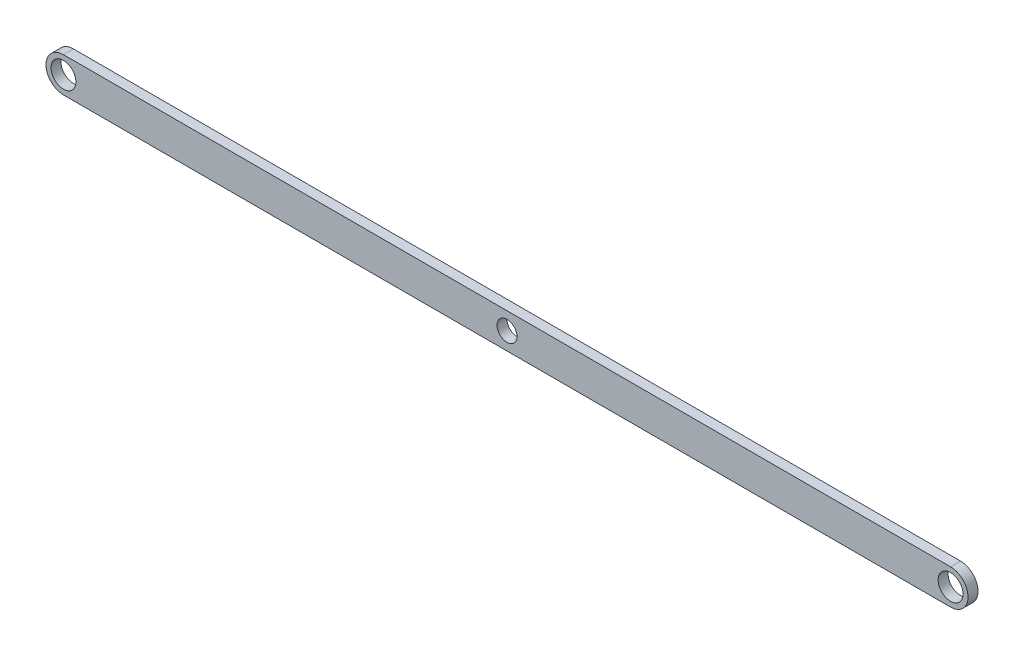
ISO-10303-21;
HEADER;
FILE_DESCRIPTION(('STEP AP214'),'2;1');
FILE_NAME('part.step','',(''),(''),'','','');
FILE_SCHEMA(('AUTOMOTIVE_DESIGN { 1 0 10303 214 1 1 1 1 }'));
ENDSEC;
DATA;
#1=APPLICATION_CONTEXT('core data for automotive mechanical design processes');
#2=APPLICATION_PROTOCOL_DEFINITION('international standard','automotive_design',2000,#1);
#3=PRODUCT_CONTEXT('',#1,'mechanical');
#4=PRODUCT('Part','Part','',(#3));
#5=PRODUCT_RELATED_PRODUCT_CATEGORY('part','',(#4));
#6=PRODUCT_DEFINITION_FORMATION('','',#4);
#7=PRODUCT_DEFINITION_CONTEXT('part definition',#1,'design');
#8=PRODUCT_DEFINITION('design','',#6,#7);
#9=PRODUCT_DEFINITION_SHAPE('','',#8);
#10=(LENGTH_UNIT() NAMED_UNIT(*) SI_UNIT(.MILLI.,.METRE.));
#11=(NAMED_UNIT(*) PLANE_ANGLE_UNIT() SI_UNIT($,.RADIAN.));
#12=(NAMED_UNIT(*) SI_UNIT($,.STERADIAN.) SOLID_ANGLE_UNIT());
#13=UNCERTAINTY_MEASURE_WITH_UNIT(LENGTH_MEASURE(1.E-05),#10,'distance_accuracy_value','');
#14=(GEOMETRIC_REPRESENTATION_CONTEXT(3) GLOBAL_UNCERTAINTY_ASSIGNED_CONTEXT((#13)) GLOBAL_UNIT_ASSIGNED_CONTEXT((#10,
#11,#12)) REPRESENTATION_CONTEXT('',''));
#15=CARTESIAN_POINT('',(0.,0.,0.));
#16=DIRECTION('',(0.,0.,1.));
#17=DIRECTION('',(1.,0.,0.));
#18=AXIS2_PLACEMENT_3D('',#15,#16,#17);
#19=CARTESIAN_POINT('',(-92.2615501062117,19.7290649407362,2.));
#20=DIRECTION('',(0.,0.,1.));
#21=DIRECTION('',(1.,0.,0.));
#22=AXIS2_PLACEMENT_3D('',#19,#20,#21);
#23=PLANE('',#22);
#24=CARTESIAN_POINT('',(-92.2615501062117,19.7290649407362,2.));
#25=DIRECTION('',(0.,0.,1.));
#26=DIRECTION('',(1.,0.,0.));
#27=AXIS2_PLACEMENT_3D('',#24,#25,#26);
#28=CIRCLE('',#27,2.49999999999999);
#29=CARTESIAN_POINT('',(-89.7615501062117,19.7290649407362,2.));
#30=VERTEX_POINT('',#29);
#31=EDGE_CURVE('E115',#30,#30,#28,.T.);
#32=ORIENTED_EDGE('',*,*,#31,.F.);
#33=EDGE_LOOP('',(#32));
#34=FACE_BOUND('',#33,.T.);
#35=CARTESIAN_POINT('',(-92.2615501062117,19.7290649407362,2.));
#36=DIRECTION('',(0.,0.,1.));
#37=DIRECTION('',(1.,0.,0.));
#38=AXIS2_PLACEMENT_3D('',#35,#36,#37);
#39=CIRCLE('',#38,3.5);
#40=CARTESIAN_POINT('',(-92.2615501062117,23.2290649407362,2.));
#41=VERTEX_POINT('',#40);
#42=CARTESIAN_POINT('',(-92.2615501062117,16.2290649407362,2.));
#43=VERTEX_POINT('',#42);
#44=EDGE_CURVE('E85',#41,#43,#39,.T.);
#45=ORIENTED_EDGE('',*,*,#44,.T.);
#46=DIRECTION('',(1.,0.,0.));
#47=VECTOR('',#46,1.);
#48=CARTESIAN_POINT('',(85.7384498937883,16.2290649407362,2.));
#49=LINE('',#48,#47);
#50=CARTESIAN_POINT('',(85.7384498937883,16.2290649407362,2.));
#51=VERTEX_POINT('',#50);
#52=EDGE_CURVE('E80',#43,#51,#49,.T.);
#53=ORIENTED_EDGE('',*,*,#52,.T.);
#54=CARTESIAN_POINT('',(85.7384498937883,19.7290649407362,2.));
#55=DIRECTION('',(0.,0.,1.));
#56=DIRECTION('',(-1.,0.,0.));
#57=AXIS2_PLACEMENT_3D('',#54,#55,#56);
#58=CIRCLE('',#57,3.50000000000001);
#59=CARTESIAN_POINT('',(85.7384498937883,23.2290649407362,2.));
#60=VERTEX_POINT('',#59);
#61=EDGE_CURVE('E83',#51,#60,#58,.T.);
#62=ORIENTED_EDGE('',*,*,#61,.T.);
#63=DIRECTION('',(-1.,0.,0.));
#64=VECTOR('',#63,1.);
#65=CARTESIAN_POINT('',(-92.2615501062117,23.2290649407362,2.));
#66=LINE('',#65,#64);
#67=EDGE_CURVE('E50',#60,#41,#66,.T.);
#68=ORIENTED_EDGE('',*,*,#67,.T.);
#69=EDGE_LOOP('',(#45,#53,#62,#68));
#70=FACE_BOUND('',#69,.T.);
#71=CARTESIAN_POINT('',(-3.26155010621174,19.7290649407362,2.));
#72=DIRECTION('',(0.,0.,1.));
#73=DIRECTION('',(1.,0.,0.));
#74=AXIS2_PLACEMENT_3D('',#71,#72,#73);
#75=CIRCLE('',#74,2.);
#76=CARTESIAN_POINT('',(-1.26155010621173,19.7290649407362,2.));
#77=VERTEX_POINT('',#76);
#78=EDGE_CURVE('E100',#77,#77,#75,.T.);
#79=ORIENTED_EDGE('',*,*,#78,.F.);
#80=EDGE_LOOP('',(#79));
#81=FACE_BOUND('',#80,.T.);
#82=CARTESIAN_POINT('',(85.7384498937883,19.7290649407362,2.));
#83=DIRECTION('',(0.,0.,1.));
#84=DIRECTION('',(1.,0.,0.));
#85=AXIS2_PLACEMENT_3D('',#82,#83,#84);
#86=CIRCLE('',#85,2.49999999999999);
#87=CARTESIAN_POINT('',(88.2384498937882,19.7290649407362,2.));
#88=VERTEX_POINT('',#87);
#89=EDGE_CURVE('E121',#88,#88,#86,.T.);
#90=ORIENTED_EDGE('',*,*,#89,.F.);
#91=EDGE_LOOP('',(#90));
#92=FACE_BOUND('',#91,.T.);
#93=ADVANCED_FACE('F33',(#34,#70,#81,#92),#23,.T.);
#94=CARTESIAN_POINT('',(-92.2615501062117,19.7290649407362,0.));
#95=DIRECTION('',(0.,0.,1.));
#96=DIRECTION('',(1.,0.,0.));
#97=AXIS2_PLACEMENT_3D('',#94,#95,#96);
#98=PLANE('',#97);
#99=CARTESIAN_POINT('',(-92.2615501062117,19.7290649407362,0.));
#100=DIRECTION('',(0.,0.,1.));
#101=DIRECTION('',(1.,0.,0.));
#102=AXIS2_PLACEMENT_3D('',#99,#100,#101);
#103=CIRCLE('',#102,3.5);
#104=CARTESIAN_POINT('',(-92.2615501062117,23.2290649407362,0.));
#105=VERTEX_POINT('',#104);
#106=CARTESIAN_POINT('',(-92.2615501062117,16.2290649407362,0.));
#107=VERTEX_POINT('',#106);
#108=EDGE_CURVE('E97',#105,#107,#103,.T.);
#109=ORIENTED_EDGE('',*,*,#108,.F.);
#110=DIRECTION('',(-1.,0.,0.));
#111=VECTOR('',#110,1.);
#112=CARTESIAN_POINT('',(-92.2615501062117,23.2290649407362,0.));
#113=LINE('',#112,#111);
#114=CARTESIAN_POINT('',(85.7384498937883,23.2290649407362,0.));
#115=VERTEX_POINT('',#114);
#116=EDGE_CURVE('E73',#115,#105,#113,.T.);
#117=ORIENTED_EDGE('',*,*,#116,.F.);
#118=CARTESIAN_POINT('',(85.7384498937883,19.7290649407362,0.));
#119=DIRECTION('',(0.,0.,1.));
#120=DIRECTION('',(-1.,0.,0.));
#121=AXIS2_PLACEMENT_3D('',#118,#119,#120);
#122=CIRCLE('',#121,3.50000000000001);
#123=CARTESIAN_POINT('',(85.7384498937883,16.2290649407362,0.));
#124=VERTEX_POINT('',#123);
#125=EDGE_CURVE('E67',#124,#115,#122,.T.);
#126=ORIENTED_EDGE('',*,*,#125,.F.);
#127=DIRECTION('',(1.,0.,0.));
#128=VECTOR('',#127,1.);
#129=CARTESIAN_POINT('',(85.7384498937883,16.2290649407362,0.));
#130=LINE('',#129,#128);
#131=EDGE_CURVE('E89',#107,#124,#130,.T.);
#132=ORIENTED_EDGE('',*,*,#131,.F.);
#133=EDGE_LOOP('',(#109,#117,#126,#132));
#134=FACE_BOUND('',#133,.T.);
#135=CARTESIAN_POINT('',(-3.26155010621174,19.7290649407362,0.));
#136=DIRECTION('',(0.,0.,1.));
#137=DIRECTION('',(1.,0.,0.));
#138=AXIS2_PLACEMENT_3D('',#135,#136,#137);
#139=CIRCLE('',#138,2.);
#140=CARTESIAN_POINT('',(-1.26155010621173,19.7290649407362,0.));
#141=VERTEX_POINT('',#140);
#142=EDGE_CURVE('E112',#141,#141,#139,.T.);
#143=ORIENTED_EDGE('',*,*,#142,.T.);
#144=EDGE_LOOP('',(#143));
#145=FACE_BOUND('',#144,.T.);
#146=CARTESIAN_POINT('',(-92.2615501062117,19.7290649407362,0.));
#147=DIRECTION('',(0.,0.,1.));
#148=DIRECTION('',(1.,0.,0.));
#149=AXIS2_PLACEMENT_3D('',#146,#147,#148);
#150=CIRCLE('',#149,2.49999999999999);
#151=CARTESIAN_POINT('',(-89.7615501062117,19.7290649407362,0.));
#152=VERTEX_POINT('',#151);
#153=EDGE_CURVE('E118',#152,#152,#150,.T.);
#154=ORIENTED_EDGE('',*,*,#153,.T.);
#155=EDGE_LOOP('',(#154));
#156=FACE_BOUND('',#155,.T.);
#157=CARTESIAN_POINT('',(85.7384498937883,19.7290649407362,0.));
#158=DIRECTION('',(0.,0.,1.));
#159=DIRECTION('',(1.,0.,0.));
#160=AXIS2_PLACEMENT_3D('',#157,#158,#159);
#161=CIRCLE('',#160,2.49999999999999);
#162=CARTESIAN_POINT('',(88.2384498937882,19.7290649407362,0.));
#163=VERTEX_POINT('',#162);
#164=EDGE_CURVE('E124',#163,#163,#161,.T.);
#165=ORIENTED_EDGE('',*,*,#164,.T.);
#166=EDGE_LOOP('',(#165));
#167=FACE_BOUND('',#166,.T.);
#168=ADVANCED_FACE('F108',(#134,#145,#156,#167),#98,.F.);
#169=CARTESIAN_POINT('',(-92.2615501062117,19.7290649407362,2.));
#170=DIRECTION('',(0.,0.,-1.));
#171=DIRECTION('',(-1.,0.,0.));
#172=AXIS2_PLACEMENT_3D('',#169,#170,#171);
#173=CYLINDRICAL_SURFACE('',#172,3.5);
#174=ORIENTED_EDGE('',*,*,#108,.T.);
#175=DIRECTION('',(0.,0.,-1.));
#176=VECTOR('',#175,1.);
#177=CARTESIAN_POINT('',(-92.2615501062117,16.2290649407362,2.));
#178=LINE('',#177,#176);
#179=EDGE_CURVE('E11',#43,#107,#178,.T.);
#180=ORIENTED_EDGE('',*,*,#179,.F.);
#181=ORIENTED_EDGE('',*,*,#44,.F.);
#182=DIRECTION('',(0.,0.,-1.));
#183=VECTOR('',#182,1.);
#184=CARTESIAN_POINT('',(-92.2615501062117,23.2290649407362,2.));
#185=LINE('',#184,#183);
#186=EDGE_CURVE('E93',#41,#105,#185,.T.);
#187=ORIENTED_EDGE('',*,*,#186,.T.);
#188=EDGE_LOOP('',(#174,#180,#181,#187));
#189=FACE_BOUND('',#188,.T.);
#190=ADVANCED_FACE('F35',(#189),#173,.T.);
#191=CARTESIAN_POINT('',(85.7384498937883,16.2290649407362,2.));
#192=DIRECTION('',(0.,1.,0.));
#193=DIRECTION('',(-1.,0.,0.));
#194=AXIS2_PLACEMENT_3D('',#191,#192,#193);
#195=PLANE('',#194);
#196=ORIENTED_EDGE('',*,*,#131,.T.);
#197=DIRECTION('',(0.,0.,-1.));
#198=VECTOR('',#197,1.);
#199=CARTESIAN_POINT('',(85.7384498937883,16.2290649407362,2.));
#200=LINE('',#199,#198);
#201=EDGE_CURVE('E42',#51,#124,#200,.T.);
#202=ORIENTED_EDGE('',*,*,#201,.F.);
#203=ORIENTED_EDGE('',*,*,#52,.F.);
#204=ORIENTED_EDGE('',*,*,#179,.T.);
#205=EDGE_LOOP('',(#196,#202,#203,#204));
#206=FACE_BOUND('',#205,.T.);
#207=ADVANCED_FACE('F88',(#206),#195,.F.);
#208=CARTESIAN_POINT('',(85.7384498937883,19.7290649407362,2.));
#209=DIRECTION('',(0.,0.,-1.));
#210=DIRECTION('',(-1.,0.,0.));
#211=AXIS2_PLACEMENT_3D('',#208,#209,#210);
#212=CYLINDRICAL_SURFACE('',#211,3.50000000000001);
#213=ORIENTED_EDGE('',*,*,#125,.T.);
#214=DIRECTION('',(0.,0.,-1.));
#215=VECTOR('',#214,1.);
#216=CARTESIAN_POINT('',(85.7384498937883,23.2290649407362,2.));
#217=LINE('',#216,#215);
#218=EDGE_CURVE('E90',#60,#115,#217,.T.);
#219=ORIENTED_EDGE('',*,*,#218,.F.);
#220=ORIENTED_EDGE('',*,*,#61,.F.);
#221=ORIENTED_EDGE('',*,*,#201,.T.);
#222=EDGE_LOOP('',(#213,#219,#220,#221));
#223=FACE_BOUND('',#222,.T.);
#224=ADVANCED_FACE('F91',(#223),#212,.T.);
#225=CARTESIAN_POINT('',(-92.2615501062117,23.2290649407362,2.));
#226=DIRECTION('',(0.,-1.,0.));
#227=DIRECTION('',(1.,0.,0.));
#228=AXIS2_PLACEMENT_3D('',#225,#226,#227);
#229=PLANE('',#228);
#230=ORIENTED_EDGE('',*,*,#116,.T.);
#231=ORIENTED_EDGE('',*,*,#186,.F.);
#232=ORIENTED_EDGE('',*,*,#67,.F.);
#233=ORIENTED_EDGE('',*,*,#218,.T.);
#234=EDGE_LOOP('',(#230,#231,#232,#233));
#235=FACE_BOUND('',#234,.T.);
#236=ADVANCED_FACE('F105',(#235),#229,.F.);
#237=CARTESIAN_POINT('',(-3.26155010621174,19.7290649407362,2.));
#238=DIRECTION('',(0.,0.,-1.));
#239=DIRECTION('',(-1.,0.,0.));
#240=AXIS2_PLACEMENT_3D('',#237,#238,#239);
#241=CYLINDRICAL_SURFACE('',#240,2.);
#242=ORIENTED_EDGE('',*,*,#78,.T.);
#243=EDGE_LOOP('',(#242));
#244=FACE_BOUND('',#243,.T.);
#245=ORIENTED_EDGE('',*,*,#142,.F.);
#246=EDGE_LOOP('',(#245));
#247=FACE_BOUND('',#246,.T.);
#248=ADVANCED_FACE('F142',(#244,#247),#241,.F.);
#249=CARTESIAN_POINT('',(-92.2615501062117,19.7290649407362,2.));
#250=DIRECTION('',(0.,0.,-1.));
#251=DIRECTION('',(-1.,0.,0.));
#252=AXIS2_PLACEMENT_3D('',#249,#250,#251);
#253=CYLINDRICAL_SURFACE('',#252,2.49999999999999);
#254=ORIENTED_EDGE('',*,*,#31,.T.);
#255=EDGE_LOOP('',(#254));
#256=FACE_BOUND('',#255,.T.);
#257=ORIENTED_EDGE('',*,*,#153,.F.);
#258=EDGE_LOOP('',(#257));
#259=FACE_BOUND('',#258,.T.);
#260=ADVANCED_FACE('F188',(#256,#259),#253,.F.);
#261=CARTESIAN_POINT('',(85.7384498937883,19.7290649407362,2.));
#262=DIRECTION('',(0.,0.,-1.));
#263=DIRECTION('',(-1.,0.,0.));
#264=AXIS2_PLACEMENT_3D('',#261,#262,#263);
#265=CYLINDRICAL_SURFACE('',#264,2.49999999999999);
#266=ORIENTED_EDGE('',*,*,#89,.T.);
#267=EDGE_LOOP('',(#266));
#268=FACE_BOUND('',#267,.T.);
#269=ORIENTED_EDGE('',*,*,#164,.F.);
#270=EDGE_LOOP('',(#269));
#271=FACE_BOUND('',#270,.T.);
#272=ADVANCED_FACE('F130',(#268,#271),#265,.F.);
#273=CLOSED_SHELL('',(#93,#168,#190,#207,#224,#236,#248,#260,#272));
#274=MANIFOLD_SOLID_BREP('B2',#273);
#275=ADVANCED_BREP_SHAPE_REPRESENTATION('',(#18,#274),#14);
#276=SHAPE_DEFINITION_REPRESENTATION(#9,#275);
ENDSEC;
END-ISO-10303-21;
